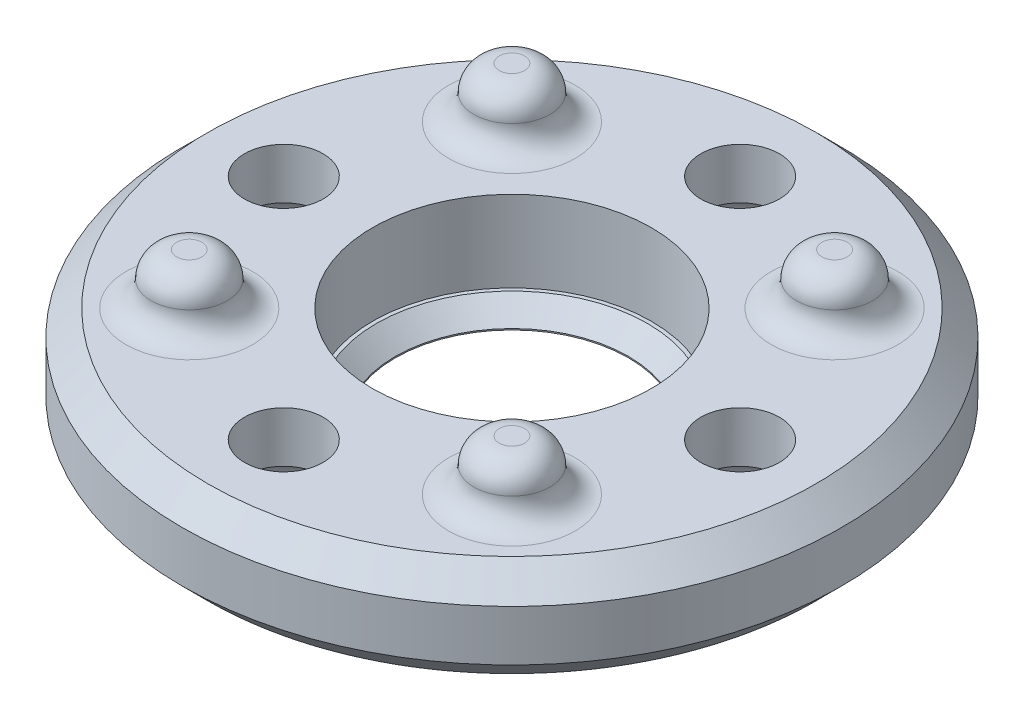
ISO-10303-21;
HEADER;
FILE_DESCRIPTION(('STEP AP214'),'2;1');
FILE_NAME('part.step','',(''),(''),'','','');
FILE_SCHEMA(('AUTOMOTIVE_DESIGN { 1 0 10303 214 1 1 1 1 }'));
ENDSEC;
DATA;
#1=APPLICATION_CONTEXT('core data for automotive mechanical design processes');
#2=APPLICATION_PROTOCOL_DEFINITION('international standard','automotive_design',2000,#1);
#3=PRODUCT_CONTEXT('',#1,'mechanical');
#4=PRODUCT('Part','Part','',(#3));
#5=PRODUCT_RELATED_PRODUCT_CATEGORY('part','',(#4));
#6=PRODUCT_DEFINITION_FORMATION('','',#4);
#7=PRODUCT_DEFINITION_CONTEXT('part definition',#1,'design');
#8=PRODUCT_DEFINITION('design','',#6,#7);
#9=PRODUCT_DEFINITION_SHAPE('','',#8);
#10=(LENGTH_UNIT() NAMED_UNIT(*) SI_UNIT(.MILLI.,.METRE.));
#11=(NAMED_UNIT(*) PLANE_ANGLE_UNIT() SI_UNIT($,.RADIAN.));
#12=(NAMED_UNIT(*) SI_UNIT($,.STERADIAN.) SOLID_ANGLE_UNIT());
#13=UNCERTAINTY_MEASURE_WITH_UNIT(LENGTH_MEASURE(1.E-05),#10,'distance_accuracy_value','');
#14=(GEOMETRIC_REPRESENTATION_CONTEXT(3) GLOBAL_UNCERTAINTY_ASSIGNED_CONTEXT((#13)) GLOBAL_UNIT_ASSIGNED_CONTEXT((#10,
#11,#12)) REPRESENTATION_CONTEXT('',''));
#15=CARTESIAN_POINT('',(0.,0.,0.));
#16=DIRECTION('',(0.,0.,1.));
#17=DIRECTION('',(1.,0.,0.));
#18=AXIS2_PLACEMENT_3D('',#15,#16,#17);
#19=CARTESIAN_POINT('',(0.,4.,0.));
#20=DIRECTION('',(0.,-1.,0.));
#21=DIRECTION('',(0.,0.,-1.));
#22=AXIS2_PLACEMENT_3D('',#19,#20,#21);
#23=CYLINDRICAL_SURFACE('',#22,5.5);
#24=CARTESIAN_POINT('',(0.,4.,0.));
#25=DIRECTION('',(0.,1.,0.));
#26=DIRECTION('',(0.,0.,1.));
#27=AXIS2_PLACEMENT_3D('',#24,#25,#26);
#28=CIRCLE('',#27,5.5);
#29=CARTESIAN_POINT('',(0.,4.,5.5));
#30=VERTEX_POINT('',#29);
#31=EDGE_CURVE('E103',#30,#30,#28,.T.);
#32=ORIENTED_EDGE('',*,*,#31,.T.);
#33=EDGE_LOOP('',(#32));
#34=FACE_BOUND('',#33,.T.);
#35=CARTESIAN_POINT('',(0.,0.8,0.));
#36=DIRECTION('',(0.,-1.,0.));
#37=DIRECTION('',(0.,0.,-1.));
#38=AXIS2_PLACEMENT_3D('',#35,#36,#37);
#39=CIRCLE('',#38,5.5);
#40=CARTESIAN_POINT('',(0.,0.8,-5.5));
#41=VERTEX_POINT('',#40);
#42=EDGE_CURVE('E92',#41,#41,#39,.T.);
#43=ORIENTED_EDGE('',*,*,#42,.T.);
#44=EDGE_LOOP('',(#43));
#45=FACE_BOUND('',#44,.T.);
#46=ADVANCED_FACE('F41',(#34,#45),#23,.F.);
#47=CARTESIAN_POINT('',(-9.,4.,0.));
#48=DIRECTION('',(0.,-1.,0.));
#49=DIRECTION('',(0.,0.,-1.));
#50=AXIS2_PLACEMENT_3D('',#47,#48,#49);
#51=CYLINDRICAL_SURFACE('',#50,1.55);
#52=CARTESIAN_POINT('',(-9.,4.,0.));
#53=DIRECTION('',(0.,-1.,0.));
#54=DIRECTION('',(0.,0.,-1.));
#55=AXIS2_PLACEMENT_3D('',#52,#53,#54);
#56=CIRCLE('',#55,1.55);
#57=CARTESIAN_POINT('',(-9.,4.,-1.55));
#58=VERTEX_POINT('',#57);
#59=EDGE_CURVE('E110',#58,#58,#56,.T.);
#60=ORIENTED_EDGE('',*,*,#59,.F.);
#61=EDGE_LOOP('',(#60));
#62=FACE_BOUND('',#61,.T.);
#63=CARTESIAN_POINT('',(-9.,2.,0.));
#64=DIRECTION('',(0.,-1.,0.));
#65=DIRECTION('',(0.,0.,-1.));
#66=AXIS2_PLACEMENT_3D('',#63,#64,#65);
#67=CIRCLE('',#66,1.55);
#68=CARTESIAN_POINT('',(-9.,2.,-1.55));
#69=VERTEX_POINT('',#68);
#70=EDGE_CURVE('E113',#69,#69,#67,.F.);
#71=ORIENTED_EDGE('',*,*,#70,.F.);
#72=EDGE_LOOP('',(#71));
#73=FACE_BOUND('',#72,.T.);
#74=ADVANCED_FACE('F197',(#62,#73),#51,.F.);
#75=CARTESIAN_POINT('',(0.,4.,-9.));
#76=DIRECTION('',(0.,-1.,0.));
#77=DIRECTION('',(0.,0.,-1.));
#78=AXIS2_PLACEMENT_3D('',#75,#76,#77);
#79=CYLINDRICAL_SURFACE('',#78,1.55);
#80=CARTESIAN_POINT('',(0.,4.,-9.));
#81=DIRECTION('',(0.,-1.,0.));
#82=DIRECTION('',(0.,0.,-1.));
#83=AXIS2_PLACEMENT_3D('',#80,#81,#82);
#84=CIRCLE('',#83,1.55);
#85=CARTESIAN_POINT('',(0.,4.,-10.55));
#86=VERTEX_POINT('',#85);
#87=EDGE_CURVE('E107',#86,#86,#84,.T.);
#88=ORIENTED_EDGE('',*,*,#87,.F.);
#89=EDGE_LOOP('',(#88));
#90=FACE_BOUND('',#89,.T.);
#91=CARTESIAN_POINT('',(0.,2.,-9.));
#92=DIRECTION('',(0.,-1.,0.));
#93=DIRECTION('',(0.,0.,-1.));
#94=AXIS2_PLACEMENT_3D('',#91,#92,#93);
#95=CIRCLE('',#94,1.55);
#96=CARTESIAN_POINT('',(0.,2.,-10.55));
#97=VERTEX_POINT('',#96);
#98=EDGE_CURVE('E119',#97,#97,#95,.F.);
#99=ORIENTED_EDGE('',*,*,#98,.F.);
#100=EDGE_LOOP('',(#99));
#101=FACE_BOUND('',#100,.T.);
#102=ADVANCED_FACE('F205',(#90,#101),#79,.F.);
#103=CARTESIAN_POINT('',(9.,4.,0.));
#104=DIRECTION('',(0.,-1.,0.));
#105=DIRECTION('',(0.,0.,-1.));
#106=AXIS2_PLACEMENT_3D('',#103,#104,#105);
#107=CYLINDRICAL_SURFACE('',#106,1.55);
#108=CARTESIAN_POINT('',(9.,4.,0.));
#109=DIRECTION('',(0.,-1.,0.));
#110=DIRECTION('',(0.,0.,-1.));
#111=AXIS2_PLACEMENT_3D('',#108,#109,#110);
#112=CIRCLE('',#111,1.55);
#113=CARTESIAN_POINT('',(9.,4.,-1.55));
#114=VERTEX_POINT('',#113);
#115=EDGE_CURVE('E104',#114,#114,#112,.T.);
#116=ORIENTED_EDGE('',*,*,#115,.F.);
#117=EDGE_LOOP('',(#116));
#118=FACE_BOUND('',#117,.T.);
#119=CARTESIAN_POINT('',(9.,2.,0.));
#120=DIRECTION('',(0.,-1.,0.));
#121=DIRECTION('',(0.,0.,-1.));
#122=AXIS2_PLACEMENT_3D('',#119,#120,#121);
#123=CIRCLE('',#122,1.55);
#124=CARTESIAN_POINT('',(9.,2.,-1.55));
#125=VERTEX_POINT('',#124);
#126=EDGE_CURVE('E87',#125,#125,#123,.F.);
#127=ORIENTED_EDGE('',*,*,#126,.F.);
#128=EDGE_LOOP('',(#127));
#129=FACE_BOUND('',#128,.T.);
#130=ADVANCED_FACE('F323',(#118,#129),#107,.F.);
#131=CARTESIAN_POINT('',(0.,4.,9.));
#132=DIRECTION('',(0.,-1.,0.));
#133=DIRECTION('',(0.,0.,-1.));
#134=AXIS2_PLACEMENT_3D('',#131,#132,#133);
#135=CYLINDRICAL_SURFACE('',#134,1.55);
#136=CARTESIAN_POINT('',(0.,4.,9.));
#137=DIRECTION('',(0.,-1.,0.));
#138=DIRECTION('',(0.,0.,-1.));
#139=AXIS2_PLACEMENT_3D('',#136,#137,#138);
#140=CIRCLE('',#139,1.55);
#141=CARTESIAN_POINT('',(0.,4.,7.45));
#142=VERTEX_POINT('',#141);
#143=EDGE_CURVE('E100',#142,#142,#140,.T.);
#144=ORIENTED_EDGE('',*,*,#143,.F.);
#145=EDGE_LOOP('',(#144));
#146=FACE_BOUND('',#145,.T.);
#147=CARTESIAN_POINT('',(0.,2.,9.));
#148=DIRECTION('',(0.,-1.,0.));
#149=DIRECTION('',(0.,0.,-1.));
#150=AXIS2_PLACEMENT_3D('',#147,#148,#149);
#151=CIRCLE('',#150,1.55);
#152=CARTESIAN_POINT('',(0.,2.,7.45));
#153=VERTEX_POINT('',#152);
#154=EDGE_CURVE('E84',#153,#153,#151,.F.);
#155=ORIENTED_EDGE('',*,*,#154,.F.);
#156=EDGE_LOOP('',(#155));
#157=FACE_BOUND('',#156,.T.);
#158=ADVANCED_FACE('F214',(#146,#157),#135,.F.);
#159=CARTESIAN_POINT('',(0.,4.,0.));
#160=DIRECTION('',(0.,1.,0.));
#161=DIRECTION('',(0.,0.,1.));
#162=AXIS2_PLACEMENT_3D('',#159,#160,#161);
#163=PLANE('',#162);
#164=CARTESIAN_POINT('',(-6.36396103067893,4.,-6.36396103067893));
#165=DIRECTION('',(0.,1.,0.));
#166=DIRECTION('',(0.,0.,1.));
#167=AXIS2_PLACEMENT_3D('',#164,#165,#166);
#168=CIRCLE('',#167,2.5);
#169=CARTESIAN_POINT('',(-6.36396103067893,4.,-3.86396103067893));
#170=VERTEX_POINT('',#169);
#171=EDGE_CURVE('E168',#170,#170,#168,.F.);
#172=ORIENTED_EDGE('',*,*,#171,.T.);
#173=EDGE_LOOP('',(#172));
#174=FACE_BOUND('',#173,.T.);
#175=CARTESIAN_POINT('',(-6.36396103067893,4.,6.36396103067893));
#176=DIRECTION('',(0.,1.,0.));
#177=DIRECTION('',(0.,0.,1.));
#178=AXIS2_PLACEMENT_3D('',#175,#176,#177);
#179=CIRCLE('',#178,2.5);
#180=CARTESIAN_POINT('',(-6.36396103067893,4.,8.86396103067892));
#181=VERTEX_POINT('',#180);
#182=EDGE_CURVE('E165',#181,#181,#179,.F.);
#183=ORIENTED_EDGE('',*,*,#182,.T.);
#184=EDGE_LOOP('',(#183));
#185=FACE_BOUND('',#184,.T.);
#186=CARTESIAN_POINT('',(6.36396103067893,4.,-6.36396103067893));
#187=DIRECTION('',(0.,1.,0.));
#188=DIRECTION('',(0.,0.,1.));
#189=AXIS2_PLACEMENT_3D('',#186,#187,#188);
#190=CIRCLE('',#189,2.5);
#191=CARTESIAN_POINT('',(6.36396103067893,4.,-3.86396103067892));
#192=VERTEX_POINT('',#191);
#193=EDGE_CURVE('E162',#192,#192,#190,.F.);
#194=ORIENTED_EDGE('',*,*,#193,.T.);
#195=EDGE_LOOP('',(#194));
#196=FACE_BOUND('',#195,.T.);
#197=CARTESIAN_POINT('',(6.36396103067893,4.,6.36396103067893));
#198=DIRECTION('',(0.,1.,0.));
#199=DIRECTION('',(0.,0.,1.));
#200=AXIS2_PLACEMENT_3D('',#197,#198,#199);
#201=CIRCLE('',#200,2.5);
#202=CARTESIAN_POINT('',(6.36396103067893,4.,8.86396103067893));
#203=VERTEX_POINT('',#202);
#204=EDGE_CURVE('E159',#203,#203,#201,.F.);
#205=ORIENTED_EDGE('',*,*,#204,.T.);
#206=EDGE_LOOP('',(#205));
#207=FACE_BOUND('',#206,.T.);
#208=CARTESIAN_POINT('',(0.,4.,0.));
#209=DIRECTION('',(0.,1.,0.));
#210=DIRECTION('',(0.,0.,1.));
#211=AXIS2_PLACEMENT_3D('',#208,#209,#210);
#212=CIRCLE('',#211,12.);
#213=CARTESIAN_POINT('',(0.,4.,12.));
#214=VERTEX_POINT('',#213);
#215=EDGE_CURVE('E135',#214,#214,#212,.T.);
#216=ORIENTED_EDGE('',*,*,#215,.T.);
#217=EDGE_LOOP('',(#216));
#218=FACE_BOUND('',#217,.T.);
#219=ORIENTED_EDGE('',*,*,#143,.T.);
#220=EDGE_LOOP('',(#219));
#221=FACE_BOUND('',#220,.T.);
#222=ORIENTED_EDGE('',*,*,#115,.T.);
#223=EDGE_LOOP('',(#222));
#224=FACE_BOUND('',#223,.T.);
#225=ORIENTED_EDGE('',*,*,#87,.T.);
#226=EDGE_LOOP('',(#225));
#227=FACE_BOUND('',#226,.T.);
#228=ORIENTED_EDGE('',*,*,#59,.T.);
#229=EDGE_LOOP('',(#228));
#230=FACE_BOUND('',#229,.T.);
#231=ORIENTED_EDGE('',*,*,#31,.F.);
#232=EDGE_LOOP('',(#231));
#233=FACE_BOUND('',#232,.T.);
#234=ADVANCED_FACE('F211',(#174,#185,#196,#207,#218,#221,#224,#227,#230,#233),#163,.T.);
#235=CARTESIAN_POINT('',(0.,0.,0.));
#236=DIRECTION('',(0.,1.,0.));
#237=DIRECTION('',(0.,0.,1.));
#238=AXIS2_PLACEMENT_3D('',#235,#236,#237);
#239=PLANE('',#238);
#240=CARTESIAN_POINT('',(0.,0.,9.));
#241=DIRECTION('',(0.,-1.,0.));
#242=DIRECTION('',(0.,0.,-1.));
#243=AXIS2_PLACEMENT_3D('',#240,#241,#242);
#244=CIRCLE('',#243,3.);
#245=CARTESIAN_POINT('',(0.,0.,12.));
#246=VERTEX_POINT('',#245);
#247=EDGE_CURVE('E76',#246,#246,#244,.T.);
#248=ORIENTED_EDGE('',*,*,#247,.F.);
#249=CARTESIAN_POINT('',(0.,0.,0.));
#250=DIRECTION('',(0.,1.,0.));
#251=DIRECTION('',(0.,0.,1.));
#252=AXIS2_PLACEMENT_3D('',#249,#250,#251);
#253=CIRCLE('',#252,12.);
#254=CARTESIAN_POINT('',(-12.,0.,0.));
#255=VERTEX_POINT('',#254);
#256=EDGE_CURVE('E145',#246,#255,#253,.F.);
#257=ORIENTED_EDGE('',*,*,#256,.T.);
#258=CARTESIAN_POINT('',(-9.,0.,0.));
#259=DIRECTION('',(0.,-1.,0.));
#260=DIRECTION('',(0.,0.,-1.));
#261=AXIS2_PLACEMENT_3D('',#258,#259,#260);
#262=CIRCLE('',#261,3.);
#263=EDGE_CURVE('E96',#255,#255,#262,.T.);
#264=ORIENTED_EDGE('',*,*,#263,.F.);
#265=CARTESIAN_POINT('',(0.,0.,0.));
#266=DIRECTION('',(0.,1.,0.));
#267=DIRECTION('',(0.,0.,1.));
#268=AXIS2_PLACEMENT_3D('',#265,#266,#267);
#269=CIRCLE('',#268,12.);
#270=CARTESIAN_POINT('',(0.,0.,-12.));
#271=VERTEX_POINT('',#270);
#272=EDGE_CURVE('E57',#255,#271,#269,.F.);
#273=ORIENTED_EDGE('',*,*,#272,.T.);
#274=CARTESIAN_POINT('',(0.,0.,-9.));
#275=DIRECTION('',(0.,-1.,0.));
#276=DIRECTION('',(0.,0.,-1.));
#277=AXIS2_PLACEMENT_3D('',#274,#275,#276);
#278=CIRCLE('',#277,3.);
#279=EDGE_CURVE('E89',#271,#271,#278,.T.);
#280=ORIENTED_EDGE('',*,*,#279,.F.);
#281=CARTESIAN_POINT('',(0.,0.,0.));
#282=DIRECTION('',(0.,1.,0.));
#283=DIRECTION('',(0.,0.,1.));
#284=AXIS2_PLACEMENT_3D('',#281,#282,#283);
#285=CIRCLE('',#284,12.);
#286=CARTESIAN_POINT('',(12.,0.,0.));
#287=VERTEX_POINT('',#286);
#288=EDGE_CURVE('E79',#271,#287,#285,.F.);
#289=ORIENTED_EDGE('',*,*,#288,.T.);
#290=CARTESIAN_POINT('',(9.,0.,0.));
#291=DIRECTION('',(0.,-1.,0.));
#292=DIRECTION('',(0.,0.,-1.));
#293=AXIS2_PLACEMENT_3D('',#290,#291,#292);
#294=CIRCLE('',#293,3.);
#295=EDGE_CURVE('E78',#287,#287,#294,.T.);
#296=ORIENTED_EDGE('',*,*,#295,.F.);
#297=CARTESIAN_POINT('',(0.,0.,0.));
#298=DIRECTION('',(0.,1.,0.));
#299=DIRECTION('',(0.,0.,1.));
#300=AXIS2_PLACEMENT_3D('',#297,#298,#299);
#301=CIRCLE('',#300,12.);
#302=EDGE_CURVE('E72',#287,#246,#301,.F.);
#303=ORIENTED_EDGE('',*,*,#302,.T.);
#304=EDGE_LOOP('',(#248,#257,#264,#273,#280,#289,#296,#303));
#305=FACE_BOUND('',#304,.T.);
#306=CARTESIAN_POINT('',(0.,0.,0.));
#307=DIRECTION('',(0.,-1.,0.));
#308=DIRECTION('',(0.,0.,-1.));
#309=AXIS2_PLACEMENT_3D('',#306,#307,#308);
#310=CIRCLE('',#309,4.6);
#311=CARTESIAN_POINT('',(0.,0.,-4.6));
#312=VERTEX_POINT('',#311);
#313=EDGE_CURVE('E581',#312,#312,#310,.T.);
#314=ORIENTED_EDGE('',*,*,#313,.F.);
#315=EDGE_LOOP('',(#314));
#316=FACE_BOUND('',#315,.T.);
#317=ADVANCED_FACE('F74',(#305,#316),#239,.F.);
#318=CARTESIAN_POINT('',(0.,4.,0.));
#319=DIRECTION('',(0.,-1.,0.));
#320=DIRECTION('',(0.,0.,-1.));
#321=AXIS2_PLACEMENT_3D('',#318,#319,#320);
#322=CYLINDRICAL_SURFACE('',#321,13.);
#323=CARTESIAN_POINT('',(0.,0.999999999999994,0.));
#324=DIRECTION('',(0.,1.,0.));
#325=DIRECTION('',(0.,0.,1.));
#326=AXIS2_PLACEMENT_3D('',#323,#324,#325);
#327=CIRCLE('',#326,13.);
#328=CARTESIAN_POINT('',(0.,0.999999999999994,13.));
#329=VERTEX_POINT('',#328);
#330=EDGE_CURVE('E80',#329,#329,#327,.T.);
#331=ORIENTED_EDGE('',*,*,#330,.T.);
#332=EDGE_LOOP('',(#331));
#333=FACE_BOUND('',#332,.T.);
#334=CARTESIAN_POINT('',(0.,3.,0.));
#335=DIRECTION('',(0.,1.,0.));
#336=DIRECTION('',(0.,0.,1.));
#337=AXIS2_PLACEMENT_3D('',#334,#335,#336);
#338=CIRCLE('',#337,13.);
#339=CARTESIAN_POINT('',(0.,3.,13.));
#340=VERTEX_POINT('',#339);
#341=EDGE_CURVE('E138',#340,#340,#338,.F.);
#342=ORIENTED_EDGE('',*,*,#341,.T.);
#343=EDGE_LOOP('',(#342));
#344=FACE_BOUND('',#343,.T.);
#345=ADVANCED_FACE('F217',(#333,#344),#322,.T.);
#346=CARTESIAN_POINT('',(0.,2.,9.));
#347=DIRECTION('',(0.,-1.,0.));
#348=DIRECTION('',(0.,0.,-1.));
#349=AXIS2_PLACEMENT_3D('',#346,#347,#348);
#350=CYLINDRICAL_SURFACE('',#349,3.);
#351=CARTESIAN_POINT('',(0.,0.500833564943505,9.));
#352=DIRECTION('',(0.,1.,0.));
#353=DIRECTION('',(0.,0.,1.));
#354=AXIS2_PLACEMENT_3D('',#351,#352,#353);
#355=CIRCLE('',#354,3.);
#356=CARTESIAN_POINT('',(0.,0.500833564943505,12.));
#357=VERTEX_POINT('',#356);
#358=EDGE_CURVE('E132',#357,#357,#355,.T.);
#359=ORIENTED_EDGE('',*,*,#358,.T.);
#360=EDGE_LOOP('',(#359));
#361=FACE_BOUND('',#360,.T.);
#362=ORIENTED_EDGE('',*,*,#247,.T.);
#363=EDGE_LOOP('',(#362));
#364=FACE_BOUND('',#363,.T.);
#365=ADVANCED_FACE('F83',(#361,#364),#350,.F.);
#366=CARTESIAN_POINT('',(9.,2.,0.));
#367=DIRECTION('',(0.,-1.,0.));
#368=DIRECTION('',(0.,0.,-1.));
#369=AXIS2_PLACEMENT_3D('',#366,#367,#368);
#370=CYLINDRICAL_SURFACE('',#369,3.);
#371=CARTESIAN_POINT('',(9.,0.500833564943505,0.));
#372=DIRECTION('',(0.,1.,0.));
#373=DIRECTION('',(0.,0.,1.));
#374=AXIS2_PLACEMENT_3D('',#371,#372,#373);
#375=CIRCLE('',#374,3.);
#376=CARTESIAN_POINT('',(9.,0.500833564943505,3.));
#377=VERTEX_POINT('',#376);
#378=EDGE_CURVE('E129',#377,#377,#375,.T.);
#379=ORIENTED_EDGE('',*,*,#378,.T.);
#380=EDGE_LOOP('',(#379));
#381=FACE_BOUND('',#380,.T.);
#382=ORIENTED_EDGE('',*,*,#295,.T.);
#383=EDGE_LOOP('',(#382));
#384=FACE_BOUND('',#383,.T.);
#385=ADVANCED_FACE('F309',(#381,#384),#370,.F.);
#386=CARTESIAN_POINT('',(0.,2.,-9.));
#387=DIRECTION('',(0.,-1.,0.));
#388=DIRECTION('',(0.,0.,-1.));
#389=AXIS2_PLACEMENT_3D('',#386,#387,#388);
#390=CYLINDRICAL_SURFACE('',#389,3.);
#391=CARTESIAN_POINT('',(0.,0.500833564943505,-9.));
#392=DIRECTION('',(0.,1.,0.));
#393=DIRECTION('',(0.,0.,1.));
#394=AXIS2_PLACEMENT_3D('',#391,#392,#393);
#395=CIRCLE('',#394,3.);
#396=CARTESIAN_POINT('',(0.,0.500833564943505,-6.));
#397=VERTEX_POINT('',#396);
#398=EDGE_CURVE('E126',#397,#397,#395,.T.);
#399=ORIENTED_EDGE('',*,*,#398,.T.);
#400=EDGE_LOOP('',(#399));
#401=FACE_BOUND('',#400,.T.);
#402=ORIENTED_EDGE('',*,*,#279,.T.);
#403=EDGE_LOOP('',(#402));
#404=FACE_BOUND('',#403,.T.);
#405=ADVANCED_FACE('F313',(#401,#404),#390,.F.);
#406=CARTESIAN_POINT('',(-9.,2.,0.));
#407=DIRECTION('',(0.,-1.,0.));
#408=DIRECTION('',(0.,0.,-1.));
#409=AXIS2_PLACEMENT_3D('',#406,#407,#408);
#410=CYLINDRICAL_SURFACE('',#409,3.);
#411=CARTESIAN_POINT('',(-9.,0.500833564943505,0.));
#412=DIRECTION('',(0.,1.,0.));
#413=DIRECTION('',(0.,0.,1.));
#414=AXIS2_PLACEMENT_3D('',#411,#412,#413);
#415=CIRCLE('',#414,3.);
#416=CARTESIAN_POINT('',(-9.,0.500833564943505,3.));
#417=VERTEX_POINT('',#416);
#418=EDGE_CURVE('E115',#417,#417,#415,.T.);
#419=ORIENTED_EDGE('',*,*,#418,.T.);
#420=EDGE_LOOP('',(#419));
#421=FACE_BOUND('',#420,.T.);
#422=ORIENTED_EDGE('',*,*,#263,.T.);
#423=EDGE_LOOP('',(#422));
#424=FACE_BOUND('',#423,.T.);
#425=ADVANCED_FACE('F225',(#421,#424),#410,.F.);
#426=CARTESIAN_POINT('',(-9.,0.500833564943505,0.));
#427=DIRECTION('',(0.,1.,0.));
#428=DIRECTION('',(0.,0.,1.));
#429=AXIS2_PLACEMENT_3D('',#426,#427,#428);
#430=TOROIDAL_SURFACE('',#429,1.5,1.5);
#431=ORIENTED_EDGE('',*,*,#418,.F.);
#432=EDGE_LOOP('',(#431));
#433=FACE_BOUND('',#432,.T.);
#434=ORIENTED_EDGE('',*,*,#70,.T.);
#435=EDGE_LOOP('',(#434));
#436=FACE_BOUND('',#435,.T.);
#437=ADVANCED_FACE('F221',(#433,#436),#430,.F.);
#438=CARTESIAN_POINT('',(0.,0.500833564943505,-9.));
#439=DIRECTION('',(0.,1.,0.));
#440=DIRECTION('',(0.,0.,1.));
#441=AXIS2_PLACEMENT_3D('',#438,#439,#440);
#442=TOROIDAL_SURFACE('',#441,1.5,1.5);
#443=ORIENTED_EDGE('',*,*,#398,.F.);
#444=EDGE_LOOP('',(#443));
#445=FACE_BOUND('',#444,.T.);
#446=ORIENTED_EDGE('',*,*,#98,.T.);
#447=EDGE_LOOP('',(#446));
#448=FACE_BOUND('',#447,.T.);
#449=ADVANCED_FACE('F224',(#445,#448),#442,.F.);
#450=CARTESIAN_POINT('',(9.,0.500833564943505,0.));
#451=DIRECTION('',(0.,1.,0.));
#452=DIRECTION('',(0.,0.,1.));
#453=AXIS2_PLACEMENT_3D('',#450,#451,#452);
#454=TOROIDAL_SURFACE('',#453,1.5,1.5);
#455=ORIENTED_EDGE('',*,*,#378,.F.);
#456=EDGE_LOOP('',(#455));
#457=FACE_BOUND('',#456,.T.);
#458=ORIENTED_EDGE('',*,*,#126,.T.);
#459=EDGE_LOOP('',(#458));
#460=FACE_BOUND('',#459,.T.);
#461=ADVANCED_FACE('F229',(#457,#460),#454,.F.);
#462=CARTESIAN_POINT('',(0.,0.500833564943505,9.));
#463=DIRECTION('',(0.,1.,0.));
#464=DIRECTION('',(0.,0.,1.));
#465=AXIS2_PLACEMENT_3D('',#462,#463,#464);
#466=TOROIDAL_SURFACE('',#465,1.5,1.5);
#467=ORIENTED_EDGE('',*,*,#358,.F.);
#468=EDGE_LOOP('',(#467));
#469=FACE_BOUND('',#468,.T.);
#470=ORIENTED_EDGE('',*,*,#154,.T.);
#471=EDGE_LOOP('',(#470));
#472=FACE_BOUND('',#471,.T.);
#473=ADVANCED_FACE('F233',(#469,#472),#466,.F.);
#474=CARTESIAN_POINT('',(0.,4.,0.));
#475=DIRECTION('',(0.,-1.,0.));
#476=DIRECTION('',(0.,0.,-1.));
#477=AXIS2_PLACEMENT_3D('',#474,#475,#476);
#478=CONICAL_SURFACE('',#477,12.,0.785398163397448);
#479=ORIENTED_EDGE('',*,*,#341,.F.);
#480=EDGE_LOOP('',(#479));
#481=FACE_BOUND('',#480,.T.);
#482=ORIENTED_EDGE('',*,*,#215,.F.);
#483=EDGE_LOOP('',(#482));
#484=FACE_BOUND('',#483,.T.);
#485=ADVANCED_FACE('F237',(#481,#484),#478,.T.);
#486=CARTESIAN_POINT('',(0.,0.999999999999994,0.));
#487=DIRECTION('',(0.,1.,0.));
#488=DIRECTION('',(0.,0.,1.));
#489=AXIS2_PLACEMENT_3D('',#486,#487,#488);
#490=CONICAL_SURFACE('',#489,13.,0.78539816339745);
#491=ORIENTED_EDGE('',*,*,#272,.F.);
#492=ORIENTED_EDGE('',*,*,#256,.F.);
#493=ORIENTED_EDGE('',*,*,#302,.F.);
#494=ORIENTED_EDGE('',*,*,#288,.F.);
#495=EDGE_LOOP('',(#491,#492,#493,#494));
#496=FACE_BOUND('',#495,.T.);
#497=ORIENTED_EDGE('',*,*,#330,.F.);
#498=EDGE_LOOP('',(#497));
#499=FACE_BOUND('',#498,.T.);
#500=ADVANCED_FACE('F245',(#496,#499),#490,.T.);
#501=CARTESIAN_POINT('',(6.36396103067893,6.,-6.36396103067893));
#502=DIRECTION('',(0.,1.,0.));
#503=DIRECTION('',(0.,0.,1.));
#504=AXIS2_PLACEMENT_3D('',#501,#502,#503);
#505=PLANE('',#504);
#506=CARTESIAN_POINT('',(6.36396103067893,6.,-6.36396103067893));
#507=DIRECTION('',(0.,1.,0.));
#508=DIRECTION('',(0.,0.,1.));
#509=AXIS2_PLACEMENT_3D('',#506,#507,#508);
#510=CIRCLE('',#509,0.500000000000001);
#511=CARTESIAN_POINT('',(6.36396103067893,6.,-5.86396103067892));
#512=VERTEX_POINT('',#511);
#513=EDGE_CURVE('E150',#512,#512,#510,.T.);
#514=ORIENTED_EDGE('',*,*,#513,.T.);
#515=EDGE_LOOP('',(#514));
#516=FACE_BOUND('',#515,.T.);
#517=ADVANCED_FACE('F251',(#516),#505,.T.);
#518=CARTESIAN_POINT('',(6.36396103067893,6.,6.36396103067893));
#519=DIRECTION('',(0.,1.,0.));
#520=DIRECTION('',(0.,0.,1.));
#521=AXIS2_PLACEMENT_3D('',#518,#519,#520);
#522=PLANE('',#521);
#523=CARTESIAN_POINT('',(6.36396103067893,6.,6.36396103067893));
#524=DIRECTION('',(0.,1.,0.));
#525=DIRECTION('',(0.,0.,1.));
#526=AXIS2_PLACEMENT_3D('',#523,#524,#525);
#527=CIRCLE('',#526,0.500000000000002);
#528=CARTESIAN_POINT('',(6.36396103067893,6.,6.86396103067893));
#529=VERTEX_POINT('',#528);
#530=EDGE_CURVE('E147',#529,#529,#527,.T.);
#531=ORIENTED_EDGE('',*,*,#530,.T.);
#532=EDGE_LOOP('',(#531));
#533=FACE_BOUND('',#532,.T.);
#534=ADVANCED_FACE('F296',(#533),#522,.T.);
#535=CARTESIAN_POINT('',(-6.36396103067893,6.,6.36396103067893));
#536=DIRECTION('',(0.,1.,0.));
#537=DIRECTION('',(0.,0.,1.));
#538=AXIS2_PLACEMENT_3D('',#535,#536,#537);
#539=PLANE('',#538);
#540=CARTESIAN_POINT('',(-6.36396103067893,6.,6.36396103067893));
#541=DIRECTION('',(0.,1.,0.));
#542=DIRECTION('',(0.,0.,1.));
#543=AXIS2_PLACEMENT_3D('',#540,#541,#542);
#544=CIRCLE('',#543,0.499999999999999);
#545=CARTESIAN_POINT('',(-6.36396103067893,6.,6.86396103067893));
#546=VERTEX_POINT('',#545);
#547=EDGE_CURVE('E153',#546,#546,#544,.T.);
#548=ORIENTED_EDGE('',*,*,#547,.T.);
#549=EDGE_LOOP('',(#548));
#550=FACE_BOUND('',#549,.T.);
#551=ADVANCED_FACE('F291',(#550),#539,.T.);
#552=CARTESIAN_POINT('',(-6.36396103067893,6.,-6.36396103067893));
#553=DIRECTION('',(0.,1.,0.));
#554=DIRECTION('',(0.,0.,1.));
#555=AXIS2_PLACEMENT_3D('',#552,#553,#554);
#556=PLANE('',#555);
#557=CARTESIAN_POINT('',(-6.36396103067893,6.,-6.36396103067893));
#558=DIRECTION('',(0.,1.,0.));
#559=DIRECTION('',(0.,0.,1.));
#560=AXIS2_PLACEMENT_3D('',#557,#558,#559);
#561=CIRCLE('',#560,0.500000000000001);
#562=CARTESIAN_POINT('',(-6.36396103067893,6.,-5.86396103067893));
#563=VERTEX_POINT('',#562);
#564=EDGE_CURVE('E156',#563,#563,#561,.T.);
#565=ORIENTED_EDGE('',*,*,#564,.T.);
#566=EDGE_LOOP('',(#565));
#567=FACE_BOUND('',#566,.T.);
#568=ADVANCED_FACE('F260',(#567),#556,.T.);
#569=CARTESIAN_POINT('',(6.36396103067893,5.,6.36396103067893));
#570=DIRECTION('',(0.,1.,0.));
#571=DIRECTION('',(0.,0.,1.));
#572=AXIS2_PLACEMENT_3D('',#569,#570,#571);
#573=TOROIDAL_SURFACE('',#572,2.5,1.);
#574=ORIENTED_EDGE('',*,*,#204,.F.);
#575=EDGE_LOOP('',(#574));
#576=FACE_BOUND('',#575,.T.);
#577=CARTESIAN_POINT('',(6.36396103067893,5.,6.36396103067893));
#578=DIRECTION('',(0.,1.,0.));
#579=DIRECTION('',(0.,0.,1.));
#580=AXIS2_PLACEMENT_3D('',#577,#578,#579);
#581=CIRCLE('',#580,1.5);
#582=CARTESIAN_POINT('',(6.36396103067893,5.,7.86396103067893));
#583=VERTEX_POINT('',#582);
#584=EDGE_CURVE('E99',#583,#583,#581,.T.);
#585=ORIENTED_EDGE('',*,*,#584,.F.);
#586=EDGE_LOOP('',(#585));
#587=FACE_BOUND('',#586,.T.);
#588=ADVANCED_FACE('F256',(#576,#587),#573,.F.);
#589=CARTESIAN_POINT('',(6.36396103067893,5.,6.36396103067893));
#590=DIRECTION('',(0.,1.,0.));
#591=DIRECTION('',(0.,0.,1.));
#592=AXIS2_PLACEMENT_3D('',#589,#590,#591);
#593=DEGENERATE_TOROIDAL_SURFACE('',#592,0.500000000000002,1.,.T.);
#594=ORIENTED_EDGE('',*,*,#584,.T.);
#595=EDGE_LOOP('',(#594));
#596=FACE_BOUND('',#595,.T.);
#597=ORIENTED_EDGE('',*,*,#530,.F.);
#598=EDGE_LOOP('',(#597));
#599=FACE_BOUND('',#598,.T.);
#600=ADVANCED_FACE('F252',(#596,#599),#593,.T.);
#601=CARTESIAN_POINT('',(6.36396103067893,5.,-6.36396103067893));
#602=DIRECTION('',(0.,1.,0.));
#603=DIRECTION('',(0.,0.,1.));
#604=AXIS2_PLACEMENT_3D('',#601,#602,#603);
#605=TOROIDAL_SURFACE('',#604,2.5,1.);
#606=ORIENTED_EDGE('',*,*,#193,.F.);
#607=EDGE_LOOP('',(#606));
#608=FACE_BOUND('',#607,.T.);
#609=CARTESIAN_POINT('',(6.36396103067893,5.,-6.36396103067893));
#610=DIRECTION('',(0.,1.,0.));
#611=DIRECTION('',(0.,0.,1.));
#612=AXIS2_PLACEMENT_3D('',#609,#610,#611);
#613=CIRCLE('',#612,1.5);
#614=CARTESIAN_POINT('',(6.36396103067893,5.,-4.86396103067892));
#615=VERTEX_POINT('',#614);
#616=EDGE_CURVE('E173',#615,#615,#613,.T.);
#617=ORIENTED_EDGE('',*,*,#616,.F.);
#618=EDGE_LOOP('',(#617));
#619=FACE_BOUND('',#618,.T.);
#620=ADVANCED_FACE('F255',(#608,#619),#605,.F.);
#621=CARTESIAN_POINT('',(6.36396103067893,5.,-6.36396103067893));
#622=DIRECTION('',(0.,1.,0.));
#623=DIRECTION('',(0.,0.,1.));
#624=AXIS2_PLACEMENT_3D('',#621,#622,#623);
#625=DEGENERATE_TOROIDAL_SURFACE('',#624,0.500000000000001,1.,.T.);
#626=ORIENTED_EDGE('',*,*,#616,.T.);
#627=EDGE_LOOP('',(#626));
#628=FACE_BOUND('',#627,.T.);
#629=ORIENTED_EDGE('',*,*,#513,.F.);
#630=EDGE_LOOP('',(#629));
#631=FACE_BOUND('',#630,.T.);
#632=ADVANCED_FACE('F262',(#628,#631),#625,.T.);
#633=CARTESIAN_POINT('',(-6.36396103067893,5.,6.36396103067893));
#634=DIRECTION('',(0.,1.,0.));
#635=DIRECTION('',(0.,0.,1.));
#636=AXIS2_PLACEMENT_3D('',#633,#634,#635);
#637=TOROIDAL_SURFACE('',#636,2.5,1.);
#638=ORIENTED_EDGE('',*,*,#182,.F.);
#639=EDGE_LOOP('',(#638));
#640=FACE_BOUND('',#639,.T.);
#641=CARTESIAN_POINT('',(-6.36396103067893,5.,6.36396103067893));
#642=DIRECTION('',(0.,1.,0.));
#643=DIRECTION('',(0.,0.,1.));
#644=AXIS2_PLACEMENT_3D('',#641,#642,#643);
#645=CIRCLE('',#644,1.5);
#646=CARTESIAN_POINT('',(-6.36396103067893,5.,7.86396103067893));
#647=VERTEX_POINT('',#646);
#648=EDGE_CURVE('E176',#647,#647,#645,.T.);
#649=ORIENTED_EDGE('',*,*,#648,.F.);
#650=EDGE_LOOP('',(#649));
#651=FACE_BOUND('',#650,.T.);
#652=ADVANCED_FACE('F265',(#640,#651),#637,.F.);
#653=CARTESIAN_POINT('',(-6.36396103067893,5.,6.36396103067893));
#654=DIRECTION('',(0.,1.,0.));
#655=DIRECTION('',(0.,0.,1.));
#656=AXIS2_PLACEMENT_3D('',#653,#654,#655);
#657=DEGENERATE_TOROIDAL_SURFACE('',#656,0.499999999999999,1.,.T.);
#658=ORIENTED_EDGE('',*,*,#648,.T.);
#659=EDGE_LOOP('',(#658));
#660=FACE_BOUND('',#659,.T.);
#661=ORIENTED_EDGE('',*,*,#547,.F.);
#662=EDGE_LOOP('',(#661));
#663=FACE_BOUND('',#662,.T.);
#664=ADVANCED_FACE('F270',(#660,#663),#657,.T.);
#665=CARTESIAN_POINT('',(-6.36396103067893,5.,-6.36396103067893));
#666=DIRECTION('',(0.,1.,0.));
#667=DIRECTION('',(0.,0.,1.));
#668=AXIS2_PLACEMENT_3D('',#665,#666,#667);
#669=TOROIDAL_SURFACE('',#668,2.5,1.);
#670=ORIENTED_EDGE('',*,*,#171,.F.);
#671=EDGE_LOOP('',(#670));
#672=FACE_BOUND('',#671,.T.);
#673=CARTESIAN_POINT('',(-6.36396103067893,5.,-6.36396103067893));
#674=DIRECTION('',(0.,1.,0.));
#675=DIRECTION('',(0.,0.,1.));
#676=AXIS2_PLACEMENT_3D('',#673,#674,#675);
#677=CIRCLE('',#676,1.5);
#678=CARTESIAN_POINT('',(-6.36396103067893,5.,-4.86396103067893));
#679=VERTEX_POINT('',#678);
#680=EDGE_CURVE('E179',#679,#679,#677,.T.);
#681=ORIENTED_EDGE('',*,*,#680,.F.);
#682=EDGE_LOOP('',(#681));
#683=FACE_BOUND('',#682,.T.);
#684=ADVANCED_FACE('F273',(#672,#683),#669,.F.);
#685=CARTESIAN_POINT('',(-6.36396103067893,5.,-6.36396103067893));
#686=DIRECTION('',(0.,1.,0.));
#687=DIRECTION('',(0.,0.,1.));
#688=AXIS2_PLACEMENT_3D('',#685,#686,#687);
#689=DEGENERATE_TOROIDAL_SURFACE('',#688,0.500000000000001,1.,.T.);
#690=ORIENTED_EDGE('',*,*,#680,.T.);
#691=EDGE_LOOP('',(#690));
#692=FACE_BOUND('',#691,.T.);
#693=ORIENTED_EDGE('',*,*,#564,.F.);
#694=EDGE_LOOP('',(#693));
#695=FACE_BOUND('',#694,.T.);
#696=ADVANCED_FACE('F278',(#692,#695),#689,.T.);
#697=CARTESIAN_POINT('',(0.,0.8,0.));
#698=DIRECTION('',(0.,-1.,0.));
#699=DIRECTION('',(0.,0.,-1.));
#700=AXIS2_PLACEMENT_3D('',#697,#698,#699);
#701=PLANE('',#700);
#702=CARTESIAN_POINT('',(0.,0.8,0.));
#703=DIRECTION('',(0.,-1.,0.));
#704=DIRECTION('',(0.,0.,-1.));
#705=AXIS2_PLACEMENT_3D('',#702,#703,#704);
#706=CIRCLE('',#705,5.35);
#707=CARTESIAN_POINT('',(0.,0.8,-5.35));
#708=VERTEX_POINT('',#707);
#709=EDGE_CURVE('E50',#708,#708,#706,.T.);
#710=ORIENTED_EDGE('',*,*,#709,.T.);
#711=EDGE_LOOP('',(#710));
#712=FACE_BOUND('',#711,.T.);
#713=ORIENTED_EDGE('',*,*,#42,.F.);
#714=EDGE_LOOP('',(#713));
#715=FACE_BOUND('',#714,.T.);
#716=ADVANCED_FACE('F184',(#712,#715),#701,.F.);
#717=CARTESIAN_POINT('',(0.,0.8,0.));
#718=DIRECTION('',(0.,-1.,0.));
#719=DIRECTION('',(0.,0.,-1.));
#720=AXIS2_PLACEMENT_3D('',#717,#718,#719);
#721=CYLINDRICAL_SURFACE('',#720,4.6);
#722=CARTESIAN_POINT('',(0.,0.0499999999999977,0.));
#723=DIRECTION('',(0.,-1.,0.));
#724=DIRECTION('',(0.,0.,-1.));
#725=AXIS2_PLACEMENT_3D('',#722,#723,#724);
#726=CIRCLE('',#725,4.6);
#727=CARTESIAN_POINT('',(0.,0.0499999999999977,-4.6));
#728=VERTEX_POINT('',#727);
#729=EDGE_CURVE('E11',#728,#728,#726,.F.);
#730=ORIENTED_EDGE('',*,*,#729,.T.);
#731=EDGE_LOOP('',(#730));
#732=FACE_BOUND('',#731,.T.);
#733=ORIENTED_EDGE('',*,*,#313,.T.);
#734=EDGE_LOOP('',(#733));
#735=FACE_BOUND('',#734,.T.);
#736=ADVANCED_FACE('F188',(#732,#735),#721,.F.);
#737=CARTESIAN_POINT('',(0.,0.8,0.));
#738=DIRECTION('',(0.,1.,0.));
#739=DIRECTION('',(0.,0.,1.));
#740=AXIS2_PLACEMENT_3D('',#737,#738,#739);
#741=CONICAL_SURFACE('',#740,5.35,0.785398163397447);
#742=ORIENTED_EDGE('',*,*,#729,.F.);
#743=EDGE_LOOP('',(#742));
#744=FACE_BOUND('',#743,.T.);
#745=ORIENTED_EDGE('',*,*,#709,.F.);
#746=EDGE_LOOP('',(#745));
#747=FACE_BOUND('',#746,.T.);
#748=ADVANCED_FACE('F44',(#744,#747),#741,.F.);
#749=CLOSED_SHELL('',(#46,#74,#102,#130,#158,#234,#317,#345,#365,#385,#405,#425,#437,#449,#461,
#473,#485,#500,#517,#534,#551,#568,#588,#600,#620,#632,#652,#664,#684,#696,#716,#736,#748));
#750=MANIFOLD_SOLID_BREP('B2',#749);
#751=ADVANCED_BREP_SHAPE_REPRESENTATION('',(#18,#750),#14);
#752=SHAPE_DEFINITION_REPRESENTATION(#9,#751);
ENDSEC;
END-ISO-10303-21;
